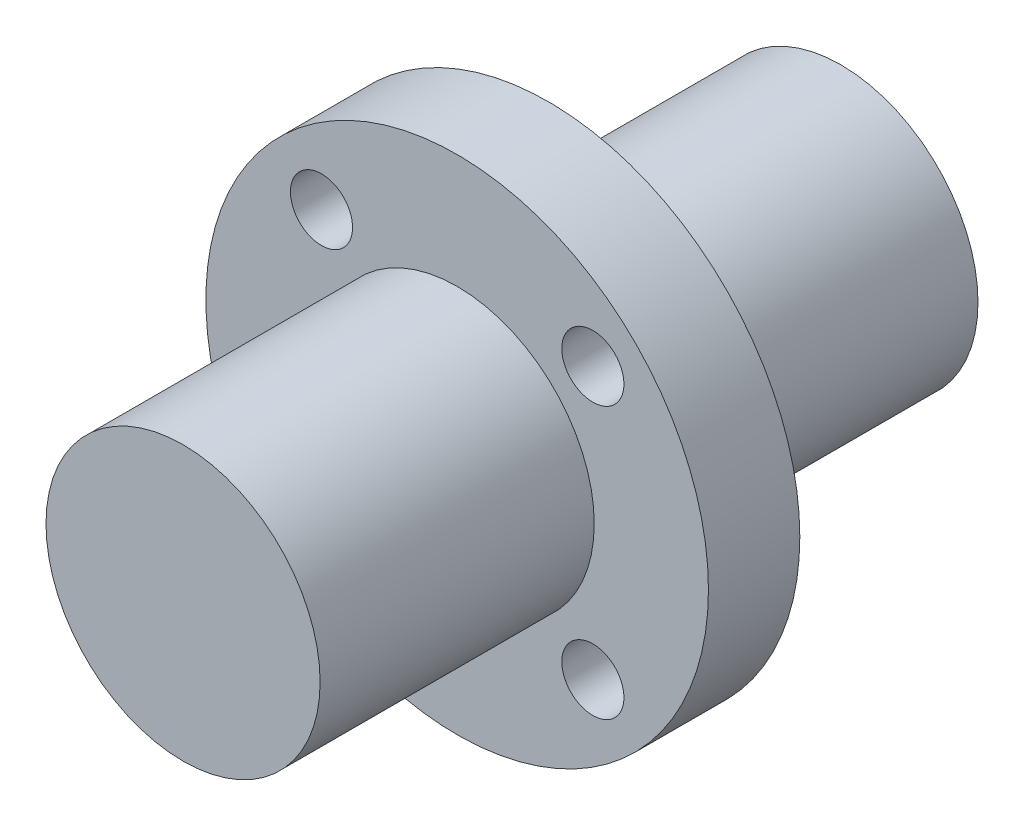
ISO-10303-21;
HEADER;
FILE_DESCRIPTION(('STEP AP214'),'2;1');
FILE_NAME('part.step','',(''),(''),'','','');
FILE_SCHEMA(('AUTOMOTIVE_DESIGN { 1 0 10303 214 1 1 1 1 }'));
ENDSEC;
DATA;
#1=APPLICATION_CONTEXT('core data for automotive mechanical design processes');
#2=APPLICATION_PROTOCOL_DEFINITION('international standard','automotive_design',2000,#1);
#3=PRODUCT_CONTEXT('',#1,'mechanical');
#4=PRODUCT('Part','Part','',(#3));
#5=PRODUCT_RELATED_PRODUCT_CATEGORY('part','',(#4));
#6=PRODUCT_DEFINITION_FORMATION('','',#4);
#7=PRODUCT_DEFINITION_CONTEXT('part definition',#1,'design');
#8=PRODUCT_DEFINITION('design','',#6,#7);
#9=PRODUCT_DEFINITION_SHAPE('','',#8);
#10=(LENGTH_UNIT() NAMED_UNIT(*) SI_UNIT(.MILLI.,.METRE.));
#11=(NAMED_UNIT(*) PLANE_ANGLE_UNIT() SI_UNIT($,.RADIAN.));
#12=(NAMED_UNIT(*) SI_UNIT($,.STERADIAN.) SOLID_ANGLE_UNIT());
#13=UNCERTAINTY_MEASURE_WITH_UNIT(LENGTH_MEASURE(1.E-05),#10,'distance_accuracy_value','');
#14=(GEOMETRIC_REPRESENTATION_CONTEXT(3) GLOBAL_UNCERTAINTY_ASSIGNED_CONTEXT((#13)) GLOBAL_UNIT_ASSIGNED_CONTEXT((#10,
#11,#12)) REPRESENTATION_CONTEXT('',''));
#15=CARTESIAN_POINT('',(0.,0.,0.));
#16=DIRECTION('',(0.,0.,1.));
#17=DIRECTION('',(1.,0.,0.));
#18=AXIS2_PLACEMENT_3D('',#15,#16,#17);
#19=CARTESIAN_POINT('',(0.,0.,10.));
#20=DIRECTION('',(0.,0.,-1.));
#21=DIRECTION('',(-1.,0.,0.));
#22=AXIS2_PLACEMENT_3D('',#19,#20,#21);
#23=CYLINDRICAL_SURFACE('',#22,27.5);
#24=CARTESIAN_POINT('',(0.,0.,10.));
#25=DIRECTION('',(0.,0.,1.));
#26=DIRECTION('',(1.,0.,0.));
#27=AXIS2_PLACEMENT_3D('',#24,#25,#26);
#28=CIRCLE('',#27,27.5);
#29=CARTESIAN_POINT('',(27.5,0.,10.));
#30=VERTEX_POINT('',#29);
#31=EDGE_CURVE('E43',#30,#30,#28,.T.);
#32=ORIENTED_EDGE('',*,*,#31,.F.);
#33=EDGE_LOOP('',(#32));
#34=FACE_BOUND('',#33,.T.);
#35=CARTESIAN_POINT('',(0.,0.,0.));
#36=DIRECTION('',(0.,0.,1.));
#37=DIRECTION('',(1.,0.,0.));
#38=AXIS2_PLACEMENT_3D('',#35,#36,#37);
#39=CIRCLE('',#38,27.5);
#40=CARTESIAN_POINT('',(27.5,0.,0.));
#41=VERTEX_POINT('',#40);
#42=EDGE_CURVE('E48',#41,#41,#39,.T.);
#43=ORIENTED_EDGE('',*,*,#42,.T.);
#44=EDGE_LOOP('',(#43));
#45=FACE_BOUND('',#44,.T.);
#46=ADVANCED_FACE('F36',(#34,#45),#23,.T.);
#47=CARTESIAN_POINT('',(0.,0.,10.));
#48=DIRECTION('',(0.,0.,1.));
#49=DIRECTION('',(1.,0.,0.));
#50=AXIS2_PLACEMENT_3D('',#47,#48,#49);
#51=PLANE('',#50);
#52=CARTESIAN_POINT('',(0.,0.,10.));
#53=DIRECTION('',(0.,0.,1.));
#54=DIRECTION('',(1.,0.,0.));
#55=AXIS2_PLACEMENT_3D('',#52,#53,#54);
#56=CIRCLE('',#55,15.);
#57=CARTESIAN_POINT('',(15.,0.,10.));
#58=VERTEX_POINT('',#57);
#59=EDGE_CURVE('E10',#58,#58,#56,.T.);
#60=ORIENTED_EDGE('',*,*,#59,.F.);
#61=EDGE_LOOP('',(#60));
#62=FACE_BOUND('',#61,.T.);
#63=CARTESIAN_POINT('',(-14.8492424049174,14.8492424049176,10.));
#64=DIRECTION('',(0.,0.,-1.));
#65=DIRECTION('',(-1.,0.,0.));
#66=AXIS2_PLACEMENT_3D('',#63,#64,#65);
#67=CIRCLE('',#66,3.4);
#68=CARTESIAN_POINT('',(-18.2492424049174,14.8492424049176,10.));
#69=VERTEX_POINT('',#68);
#70=EDGE_CURVE('E57',#69,#69,#67,.T.);
#71=ORIENTED_EDGE('',*,*,#70,.T.);
#72=EDGE_LOOP('',(#71));
#73=FACE_BOUND('',#72,.T.);
#74=CARTESIAN_POINT('',(14.8492424049176,14.8492424049174,10.));
#75=DIRECTION('',(0.,0.,-1.));
#76=DIRECTION('',(-1.,0.,0.));
#77=AXIS2_PLACEMENT_3D('',#74,#75,#76);
#78=CIRCLE('',#77,3.4);
#79=CARTESIAN_POINT('',(11.4492424049176,14.8492424049174,10.));
#80=VERTEX_POINT('',#79);
#81=EDGE_CURVE('E63',#80,#80,#78,.T.);
#82=ORIENTED_EDGE('',*,*,#81,.T.);
#83=EDGE_LOOP('',(#82));
#84=FACE_BOUND('',#83,.T.);
#85=CARTESIAN_POINT('',(14.8492424049173,-14.8492424049177,10.));
#86=DIRECTION('',(0.,0.,-1.));
#87=DIRECTION('',(-1.,0.,0.));
#88=AXIS2_PLACEMENT_3D('',#85,#86,#87);
#89=CIRCLE('',#88,3.4);
#90=CARTESIAN_POINT('',(11.4492424049173,-14.8492424049177,10.));
#91=VERTEX_POINT('',#90);
#92=EDGE_CURVE('E69',#91,#91,#89,.T.);
#93=ORIENTED_EDGE('',*,*,#92,.T.);
#94=EDGE_LOOP('',(#93));
#95=FACE_BOUND('',#94,.T.);
#96=CARTESIAN_POINT('',(-14.8492424049177,-14.8492424049173,10.));
#97=DIRECTION('',(0.,0.,-1.));
#98=DIRECTION('',(-1.,0.,0.));
#99=AXIS2_PLACEMENT_3D('',#96,#97,#98);
#100=CIRCLE('',#99,3.4);
#101=CARTESIAN_POINT('',(-18.2492424049177,-14.8492424049173,10.));
#102=VERTEX_POINT('',#101);
#103=EDGE_CURVE('E75',#102,#102,#100,.T.);
#104=ORIENTED_EDGE('',*,*,#103,.T.);
#105=EDGE_LOOP('',(#104));
#106=FACE_BOUND('',#105,.T.);
#107=ORIENTED_EDGE('',*,*,#31,.T.);
#108=EDGE_LOOP('',(#107));
#109=FACE_BOUND('',#108,.T.);
#110=ADVANCED_FACE('F84',(#62,#73,#84,#95,#106,#109),#51,.T.);
#111=CARTESIAN_POINT('',(0.,0.,0.));
#112=DIRECTION('',(0.,0.,1.));
#113=DIRECTION('',(1.,0.,0.));
#114=AXIS2_PLACEMENT_3D('',#111,#112,#113);
#115=PLANE('',#114);
#116=CARTESIAN_POINT('',(0.,0.,0.));
#117=DIRECTION('',(0.,0.,1.));
#118=DIRECTION('',(1.,0.,0.));
#119=AXIS2_PLACEMENT_3D('',#116,#117,#118);
#120=CIRCLE('',#119,15.);
#121=CARTESIAN_POINT('',(15.,0.,0.));
#122=VERTEX_POINT('',#121);
#123=EDGE_CURVE('E39',#122,#122,#120,.T.);
#124=ORIENTED_EDGE('',*,*,#123,.T.);
#125=EDGE_LOOP('',(#124));
#126=FACE_BOUND('',#125,.T.);
#127=CARTESIAN_POINT('',(-14.8492424049174,14.8492424049176,0.));
#128=DIRECTION('',(0.,0.,-1.));
#129=DIRECTION('',(-1.,0.,0.));
#130=AXIS2_PLACEMENT_3D('',#127,#128,#129);
#131=CIRCLE('',#130,3.4);
#132=CARTESIAN_POINT('',(-18.2492424049174,14.8492424049176,0.));
#133=VERTEX_POINT('',#132);
#134=EDGE_CURVE('E54',#133,#133,#131,.T.);
#135=ORIENTED_EDGE('',*,*,#134,.F.);
#136=EDGE_LOOP('',(#135));
#137=FACE_BOUND('',#136,.T.);
#138=CARTESIAN_POINT('',(14.8492424049176,14.8492424049174,0.));
#139=DIRECTION('',(0.,0.,-1.));
#140=DIRECTION('',(-1.,0.,0.));
#141=AXIS2_PLACEMENT_3D('',#138,#139,#140);
#142=CIRCLE('',#141,3.4);
#143=CARTESIAN_POINT('',(11.4492424049176,14.8492424049174,0.));
#144=VERTEX_POINT('',#143);
#145=EDGE_CURVE('E60',#144,#144,#142,.T.);
#146=ORIENTED_EDGE('',*,*,#145,.F.);
#147=EDGE_LOOP('',(#146));
#148=FACE_BOUND('',#147,.T.);
#149=CARTESIAN_POINT('',(14.8492424049173,-14.8492424049177,0.));
#150=DIRECTION('',(0.,0.,-1.));
#151=DIRECTION('',(-1.,0.,0.));
#152=AXIS2_PLACEMENT_3D('',#149,#150,#151);
#153=CIRCLE('',#152,3.4);
#154=CARTESIAN_POINT('',(11.4492424049173,-14.8492424049177,0.));
#155=VERTEX_POINT('',#154);
#156=EDGE_CURVE('E66',#155,#155,#153,.T.);
#157=ORIENTED_EDGE('',*,*,#156,.F.);
#158=EDGE_LOOP('',(#157));
#159=FACE_BOUND('',#158,.T.);
#160=CARTESIAN_POINT('',(-14.8492424049177,-14.8492424049173,0.));
#161=DIRECTION('',(0.,0.,-1.));
#162=DIRECTION('',(-1.,0.,0.));
#163=AXIS2_PLACEMENT_3D('',#160,#161,#162);
#164=CIRCLE('',#163,3.4);
#165=CARTESIAN_POINT('',(-18.2492424049177,-14.8492424049173,0.));
#166=VERTEX_POINT('',#165);
#167=EDGE_CURVE('E72',#166,#166,#164,.T.);
#168=ORIENTED_EDGE('',*,*,#167,.F.);
#169=EDGE_LOOP('',(#168));
#170=FACE_BOUND('',#169,.T.);
#171=ORIENTED_EDGE('',*,*,#42,.F.);
#172=EDGE_LOOP('',(#171));
#173=FACE_BOUND('',#172,.T.);
#174=ADVANCED_FACE('F81',(#126,#137,#148,#159,#170,#173),#115,.F.);
#175=CARTESIAN_POINT('',(-14.8492424049177,-14.8492424049173,0.));
#176=DIRECTION('',(0.,0.,-1.));
#177=DIRECTION('',(-1.,0.,0.));
#178=AXIS2_PLACEMENT_3D('',#175,#176,#177);
#179=CYLINDRICAL_SURFACE('',#178,3.4);
#180=ORIENTED_EDGE('',*,*,#103,.F.);
#181=EDGE_LOOP('',(#180));
#182=FACE_BOUND('',#181,.T.);
#183=ORIENTED_EDGE('',*,*,#167,.T.);
#184=EDGE_LOOP('',(#183));
#185=FACE_BOUND('',#184,.T.);
#186=ADVANCED_FACE('F83',(#182,#185),#179,.F.);
#187=CARTESIAN_POINT('',(14.8492424049173,-14.8492424049177,0.));
#188=DIRECTION('',(0.,0.,-1.));
#189=DIRECTION('',(-1.,0.,0.));
#190=AXIS2_PLACEMENT_3D('',#187,#188,#189);
#191=CYLINDRICAL_SURFACE('',#190,3.4);
#192=ORIENTED_EDGE('',*,*,#92,.F.);
#193=EDGE_LOOP('',(#192));
#194=FACE_BOUND('',#193,.T.);
#195=ORIENTED_EDGE('',*,*,#156,.T.);
#196=EDGE_LOOP('',(#195));
#197=FACE_BOUND('',#196,.T.);
#198=ADVANCED_FACE('F90',(#194,#197),#191,.F.);
#199=CARTESIAN_POINT('',(14.8492424049176,14.8492424049174,0.));
#200=DIRECTION('',(0.,0.,-1.));
#201=DIRECTION('',(-1.,0.,0.));
#202=AXIS2_PLACEMENT_3D('',#199,#200,#201);
#203=CYLINDRICAL_SURFACE('',#202,3.4);
#204=ORIENTED_EDGE('',*,*,#81,.F.);
#205=EDGE_LOOP('',(#204));
#206=FACE_BOUND('',#205,.T.);
#207=ORIENTED_EDGE('',*,*,#145,.T.);
#208=EDGE_LOOP('',(#207));
#209=FACE_BOUND('',#208,.T.);
#210=ADVANCED_FACE('F165',(#206,#209),#203,.F.);
#211=CARTESIAN_POINT('',(-14.8492424049174,14.8492424049176,0.));
#212=DIRECTION('',(0.,0.,-1.));
#213=DIRECTION('',(-1.,0.,0.));
#214=AXIS2_PLACEMENT_3D('',#211,#212,#213);
#215=CYLINDRICAL_SURFACE('',#214,3.4);
#216=ORIENTED_EDGE('',*,*,#70,.F.);
#217=EDGE_LOOP('',(#216));
#218=FACE_BOUND('',#217,.T.);
#219=ORIENTED_EDGE('',*,*,#134,.T.);
#220=EDGE_LOOP('',(#219));
#221=FACE_BOUND('',#220,.T.);
#222=ADVANCED_FACE('F114',(#218,#221),#215,.F.);
#223=CARTESIAN_POINT('',(0.,0.,-32.));
#224=DIRECTION('',(0.,0.,-1.));
#225=DIRECTION('',(-1.,0.,0.));
#226=AXIS2_PLACEMENT_3D('',#223,#224,#225);
#227=PLANE('',#226);
#228=CARTESIAN_POINT('',(0.,0.,-32.));
#229=DIRECTION('',(0.,0.,-1.));
#230=DIRECTION('',(-1.,0.,0.));
#231=AXIS2_PLACEMENT_3D('',#228,#229,#230);
#232=CIRCLE('',#231,15.);
#233=CARTESIAN_POINT('',(-15.,0.,-32.));
#234=VERTEX_POINT('',#233);
#235=EDGE_CURVE('E218',#234,#234,#232,.T.);
#236=ORIENTED_EDGE('',*,*,#235,.T.);
#237=EDGE_LOOP('',(#236));
#238=FACE_BOUND('',#237,.T.);
#239=ADVANCED_FACE('F124',(#238),#227,.T.);
#240=CARTESIAN_POINT('',(0.,0.,40.));
#241=DIRECTION('',(0.,0.,-1.));
#242=DIRECTION('',(-1.,0.,0.));
#243=AXIS2_PLACEMENT_3D('',#240,#241,#242);
#244=CYLINDRICAL_SURFACE('',#243,15.);
#245=ORIENTED_EDGE('',*,*,#235,.F.);
#246=EDGE_LOOP('',(#245));
#247=FACE_BOUND('',#246,.T.);
#248=ORIENTED_EDGE('',*,*,#123,.F.);
#249=EDGE_LOOP('',(#248));
#250=FACE_BOUND('',#249,.T.);
#251=ADVANCED_FACE('F129',(#247,#250),#244,.T.);
#252=ORIENTED_EDGE('',*,*,#59,.T.);
#253=EDGE_LOOP('',(#252));
#254=FACE_BOUND('',#253,.T.);
#255=CARTESIAN_POINT('',(0.,0.,40.));
#256=DIRECTION('',(0.,0.,-1.));
#257=DIRECTION('',(-1.,0.,0.));
#258=AXIS2_PLACEMENT_3D('',#255,#256,#257);
#259=CIRCLE('',#258,15.);
#260=CARTESIAN_POINT('',(-15.,0.,40.));
#261=VERTEX_POINT('',#260);
#262=EDGE_CURVE('E52',#261,#261,#259,.T.);
#263=ORIENTED_EDGE('',*,*,#262,.T.);
#264=EDGE_LOOP('',(#263));
#265=FACE_BOUND('',#264,.T.);
#266=ADVANCED_FACE('F140',(#254,#265),#244,.T.);
#267=CARTESIAN_POINT('',(0.,0.,40.));
#268=DIRECTION('',(0.,0.,-1.));
#269=DIRECTION('',(-1.,0.,0.));
#270=AXIS2_PLACEMENT_3D('',#267,#268,#269);
#271=PLANE('',#270);
#272=ORIENTED_EDGE('',*,*,#262,.F.);
#273=EDGE_LOOP('',(#272));
#274=FACE_BOUND('',#273,.T.);
#275=ADVANCED_FACE('F150',(#274),#271,.F.);
#276=CLOSED_SHELL('',(#46,#110,#174,#186,#198,#210,#222,#239,#251,#266,#275));
#277=MANIFOLD_SOLID_BREP('B2',#276);
#278=ADVANCED_BREP_SHAPE_REPRESENTATION('',(#18,#277),#14);
#279=SHAPE_DEFINITION_REPRESENTATION(#9,#278);
ENDSEC;
END-ISO-10303-21;
